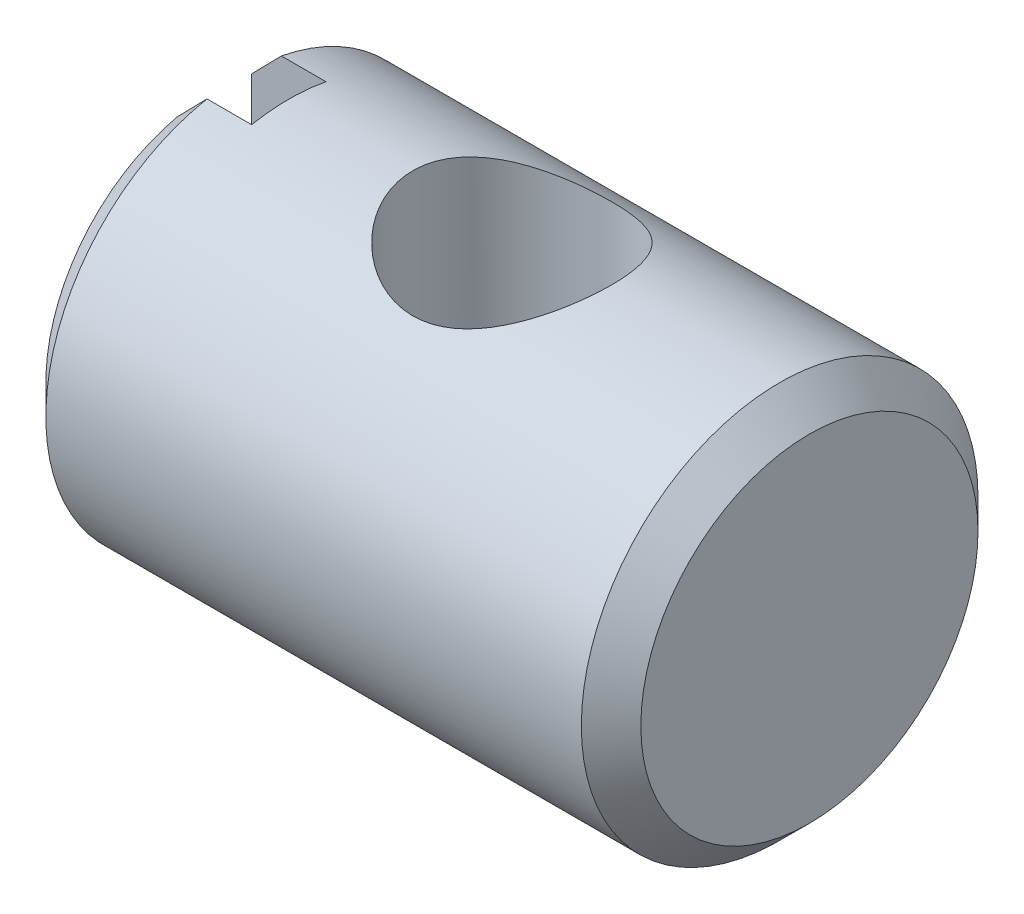
ISO-10303-21;
HEADER;
FILE_DESCRIPTION(('STEP AP214'),'2;1');
FILE_NAME('part.step','',(''),(''),'','','');
FILE_SCHEMA(('AUTOMOTIVE_DESIGN { 1 0 10303 214 1 1 1 1 }'));
ENDSEC;
DATA;
#1=APPLICATION_CONTEXT('core data for automotive mechanical design processes');
#2=APPLICATION_PROTOCOL_DEFINITION('international standard','automotive_design',2000,#1);
#3=PRODUCT_CONTEXT('',#1,'mechanical');
#4=PRODUCT('Part','Part','',(#3));
#5=PRODUCT_RELATED_PRODUCT_CATEGORY('part','',(#4));
#6=PRODUCT_DEFINITION_FORMATION('','',#4);
#7=PRODUCT_DEFINITION_CONTEXT('part definition',#1,'design');
#8=PRODUCT_DEFINITION('design','',#6,#7);
#9=PRODUCT_DEFINITION_SHAPE('','',#8);
#10=(LENGTH_UNIT() NAMED_UNIT(*) SI_UNIT(.MILLI.,.METRE.));
#11=(NAMED_UNIT(*) PLANE_ANGLE_UNIT() SI_UNIT($,.RADIAN.));
#12=(NAMED_UNIT(*) SI_UNIT($,.STERADIAN.) SOLID_ANGLE_UNIT());
#13=UNCERTAINTY_MEASURE_WITH_UNIT(LENGTH_MEASURE(1.E-05),#10,'distance_accuracy_value','');
#14=(GEOMETRIC_REPRESENTATION_CONTEXT(3) GLOBAL_UNCERTAINTY_ASSIGNED_CONTEXT((#13)) GLOBAL_UNIT_ASSIGNED_CONTEXT((#10,
#11,#12)) REPRESENTATION_CONTEXT('',''));
#15=CARTESIAN_POINT('',(0.,0.,0.));
#16=DIRECTION('',(0.,0.,1.));
#17=DIRECTION('',(1.,0.,0.));
#18=AXIS2_PLACEMENT_3D('',#15,#16,#17);
#19=CARTESIAN_POINT('',(-6.,0.,0.));
#20=DIRECTION('',(1.,0.,0.));
#21=DIRECTION('',(0.,0.,1.));
#22=AXIS2_PLACEMENT_3D('',#19,#20,#21);
#23=PLANE('',#22);
#24=CARTESIAN_POINT('',(-6.,0.,0.));
#25=DIRECTION('',(-1.,0.,0.));
#26=DIRECTION('',(0.,0.,1.));
#27=AXIS2_PLACEMENT_3D('',#24,#25,#26);
#28=CIRCLE('',#27,3.4);
#29=CARTESIAN_POINT('',(-6.,3.31624787975808,0.75));
#30=VERTEX_POINT('',#29);
#31=CARTESIAN_POINT('',(-6.,-3.31624787975808,0.75));
#32=VERTEX_POINT('',#31);
#33=EDGE_CURVE('E109',#30,#32,#28,.F.);
#34=ORIENTED_EDGE('',*,*,#33,.F.);
#35=DIRECTION('',(0.,-1.,0.));
#36=VECTOR('',#35,1.);
#37=CARTESIAN_POINT('',(-6.,-5.08936353423906,0.75));
#38=LINE('',#37,#36);
#39=EDGE_CURVE('E105',#30,#32,#38,.T.);
#40=ORIENTED_EDGE('',*,*,#39,.T.);
#41=EDGE_LOOP('',(#34,#40));
#42=FACE_BOUND('',#41,.T.);
#43=ADVANCED_FACE('F37',(#42),#23,.F.);
#44=CARTESIAN_POINT('',(-5.4,0.,0.));
#45=DIRECTION('',(1.,0.,0.));
#46=DIRECTION('',(0.,0.,1.));
#47=AXIS2_PLACEMENT_3D('',#44,#45,#46);
#48=CONICAL_SURFACE('',#47,4.,0.785398163397448);
#49=CARTESIAN_POINT('',(-0.586318931168419,8.78171247440271,0.75));
#50=CARTESIAN_POINT('',(-0.89911517881567,8.46776722729489,0.75));
#51=CARTESIAN_POINT('',(-1.21186022148148,8.1537708958006,0.75));
#52=CARTESIAN_POINT('',(-1.83719494459531,7.52558697275872,0.75));
#53=CARTESIAN_POINT('',(-2.14978461487386,7.21139937108854,0.75));
#54=CARTESIAN_POINT('',(-2.77515805316192,6.58233891694838,0.75));
#55=CARTESIAN_POINT('',(-3.08794147672292,6.26746572194293,0.75));
#56=CARTESIAN_POINT('',(-3.71310786552485,5.63735753970191,0.75));
#57=CARTESIAN_POINT('',(-4.02549085255156,5.32212257408525,0.75));
#58=CARTESIAN_POINT('',(-4.63095471200261,4.70991108309659,0.75));
#59=CARTESIAN_POINT('',(-4.92407209660478,4.41297070666081,0.75));
#60=CARTESIAN_POINT('',(-5.36301711479325,3.96679034127691,0.75));
#61=CARTESIAN_POINT('',(-5.50922280774287,3.81792242946439,0.75));
#62=CARTESIAN_POINT('',(-5.8012714742329,3.51983580450674,0.75));
#63=CARTESIAN_POINT('',(-5.94711445356469,3.37061709703764,0.75));
#64=CARTESIAN_POINT('',(-6.23815525647998,3.07179369372605,0.75));
#65=CARTESIAN_POINT('',(-6.383353516978,2.92218942405654,0.75));
#66=CARTESIAN_POINT('',(-6.6729455601872,2.62218613066518,0.75));
#67=CARTESIAN_POINT('',(-6.81733929236243,2.47178705814911,0.75));
#68=CARTESIAN_POINT('',(-7.10475426782723,2.16976130425436,0.75));
#69=CARTESIAN_POINT('',(-7.2477759093094,2.01813500412178,0.75));
#70=CARTESIAN_POINT('',(-7.46040576630658,1.78894239159525,0.75));
#71=CARTESIAN_POINT('',(-7.53096183090568,1.71225650870654,0.75));
#72=CARTESIAN_POINT('',(-7.67114403465676,1.55804045062791,0.75));
#73=CARTESIAN_POINT('',(-7.74077020981574,1.48051030834152,0.75));
#74=CARTESIAN_POINT('',(-7.82894089355626,1.38051818592761,0.75));
#75=CARTESIAN_POINT('',(-7.84814001283776,1.35863324199629,0.75));
#76=CARTESIAN_POINT('',(-7.88640996667428,1.31475109781654,0.75));
#77=CARTESIAN_POINT('',(-7.9054807998849,1.29275389639593,0.75));
#78=CARTESIAN_POINT('',(-7.96247837839367,1.22656954820506,0.75));
#79=CARTESIAN_POINT('',(-8.00018671971951,1.18219359522638,0.75));
#80=CARTESIAN_POINT('',(-8.07521139767381,1.09232954284376,0.75));
#81=CARTESIAN_POINT('',(-8.11251967226824,1.04683469214758,0.75));
#82=CARTESIAN_POINT('',(-8.18603196961103,0.954975461061185,0.75));
#83=CARTESIAN_POINT('',(-8.22223626899139,0.908611303281593,0.75));
#84=CARTESIAN_POINT('',(-8.29348308271563,0.814159220934126,0.75));
#85=CARTESIAN_POINT('',(-8.32850767361611,0.76605767964873,0.75));
#86=CARTESIAN_POINT('',(-8.39620368659304,0.668105125068649,0.75));
#87=CARTESIAN_POINT('',(-8.42887194187332,0.618251886557387,0.75));
#88=CARTESIAN_POINT('',(-8.49011198361584,0.516746551056438,0.75));
#89=CARTESIAN_POINT('',(-8.51872209860146,0.465117942665969,0.75));
#90=CARTESIAN_POINT('',(-8.56982814317297,0.358933249234864,0.75));
#91=CARTESIAN_POINT('',(-8.59234286669187,0.30438679840185,0.75));
#92=CARTESIAN_POINT('',(-8.61802261195062,0.222661735256584,0.75));
#93=CARTESIAN_POINT('',(-8.62505610986014,0.196705154324282,0.75));
#94=CARTESIAN_POINT('',(-8.63668327119189,0.144243129404284,0.75));
#95=CARTESIAN_POINT('',(-8.64127731698223,0.117737772110777,0.75));
#96=CARTESIAN_POINT('',(-8.64768999327354,0.0645252709876592,0.75));
#97=CARTESIAN_POINT('',(-8.64952279966187,0.0378198701031724,0.75));
#98=CARTESIAN_POINT('',(-8.6503131508692,-0.0156348454490843,0.75));
#99=CARTESIAN_POINT('',(-8.6492706759624,-0.0423841604168676,0.75));
#100=CARTESIAN_POINT('',(-8.64440528787136,-0.0955002479492756,0.75));
#101=CARTESIAN_POINT('',(-8.64059501621247,-0.121868205752437,0.75));
#102=CARTESIAN_POINT('',(-8.63048014930018,-0.174123602459967,0.75));
#103=CARTESIAN_POINT('',(-8.62417444936742,-0.200010823230418,0.75));
#104=CARTESIAN_POINT('',(-8.60939063400642,-0.251340911559103,0.75));
#105=CARTESIAN_POINT('',(-8.60089783294052,-0.276779482055886,0.75));
#106=CARTESIAN_POINT('',(-8.58215088842634,-0.326984908378452,0.75));
#107=CARTESIAN_POINT('',(-8.57189700515739,-0.351751862802719,0.75));
#108=CARTESIAN_POINT('',(-8.54184128834097,-0.41879721358808,0.75));
#109=CARTESIAN_POINT('',(-8.52060179926991,-0.460428199746916,0.75));
#110=CARTESIAN_POINT('',(-8.47522317647946,-0.54209238327936,0.75));
#111=CARTESIAN_POINT('',(-8.4510808862854,-0.582123777113933,0.75));
#112=CARTESIAN_POINT('',(-8.40072672716821,-0.661038955930545,0.75));
#113=CARTESIAN_POINT('',(-8.37450825006854,-0.699918487179986,0.75));
#114=CARTESIAN_POINT('',(-8.32065019422312,-0.776685038987865,0.75));
#115=CARTESIAN_POINT('',(-8.29301026661477,-0.814571812419269,0.75));
#116=CARTESIAN_POINT('',(-8.2080605632463,-0.927765545716539,0.75));
#117=CARTESIAN_POINT('',(-8.1491930190133,-1.00189997374979,0.75));
#118=CARTESIAN_POINT('',(-8.05923063658955,-1.11156691284701,0.75));
#119=CARTESIAN_POINT('',(-8.02900134378288,-1.14782675761595,0.75));
#120=CARTESIAN_POINT('',(-7.96807610532063,-1.21995170040627,0.75));
#121=CARTESIAN_POINT('',(-7.93738017859007,-1.25581681433537,0.75));
#122=CARTESIAN_POINT('',(-7.84607570269691,-1.36140263252394,0.75));
#123=CARTESIAN_POINT('',(-7.78495259254737,-1.4306773325886,0.75));
#124=CARTESIAN_POINT('',(-7.66177481425132,-1.56839537144039,0.75));
#125=CARTESIAN_POINT('',(-7.59972010396873,-1.63683867236869,0.75));
#126=CARTESIAN_POINT('',(-7.41257753872586,-1.84130512640933,0.75));
#127=CARTESIAN_POINT('',(-7.28652759563928,-1.97644628187093,0.75));
#128=CARTESIAN_POINT('',(-7.03290023140085,-2.24558248181855,0.75));
#129=CARTESIAN_POINT('',(-6.90532117214649,-2.37957597237069,0.75));
#130=CARTESIAN_POINT('',(-6.64931980167584,-2.64673393796254,0.75));
#131=CARTESIAN_POINT('',(-6.52089755906573,-2.779898478774,0.75));
#132=CARTESIAN_POINT('',(-6.26467750445008,-3.04447337872307,0.75));
#133=CARTESIAN_POINT('',(-6.1368847414103,-3.17588863552843,0.75));
#134=CARTESIAN_POINT('',(-5.88091851050585,-3.43835302392329,0.75));
#135=CARTESIAN_POINT('',(-5.75274503479878,-3.56940214786129,0.75));
#136=CARTESIAN_POINT('',(-5.36794145192988,-3.96203591841447,0.75));
#137=CARTESIAN_POINT('',(-5.1109107523662,-4.22322777332833,0.75));
#138=CARTESIAN_POINT('',(-4.50104911211646,-4.84155706238019,0.75));
#139=CARTESIAN_POINT('',(-4.1479586197436,-5.19843819113416,0.75));
#140=CARTESIAN_POINT('',(-3.44112712202132,-5.91167425229548,0.75));
#141=CARTESIAN_POINT('',(-3.08738601726198,-6.26802908612066,0.75));
#142=CARTESIAN_POINT('',(-2.37586014632471,-6.98410294385875,0.75));
#143=CARTESIAN_POINT('',(-2.01807168367367,-7.3438182936353,0.75));
#144=CARTESIAN_POINT('',(-1.30231546818728,-8.06294690781502,0.75));
#145=CARTESIAN_POINT('',(-0.944347757003069,-8.42236021366946,0.75));
#146=CARTESIAN_POINT('',(-0.586318931168417,-8.78171247440271,0.75));
#147=B_SPLINE_CURVE_WITH_KNOTS('',3,(#49,#50,#51,#52,#53,#54,#55,#56,#57,#58,#59,#60,#61,#62,
#63,#64,#65,#66,#67,#68,#69,#70,#71,#72,#73,#74,#75,#76,#77,#78,#79,#80,#81,#82,#83,#84,#85,#86,
#87,#88,#89,#90,#91,#92,#93,#94,#95,#96,#97,#98,#99,#100,#101,#102,#103,#104,#105,#106,#107,
#108,#109,#110,#111,#112,#113,#114,#115,#116,#117,#118,#119,#120,#121,#122,#123,#124,#125,#126,
#127,#128,#129,#130,#131,#132,#133,#134,#135,#136,#137,#138,#139,#140,#141,#142,#143,#144,#145,
#146),.UNSPECIFIED.,.F.,.F.,(4,2,2,2,2,2,2,2,2,2,2,2,2,2,2,2,2,2,2,2,2,2,2,2,2,2,2,2,2,2,2,2,2,
2,2,2,2,2,2,2,2,2,2,2,2,2,2,2,4),(0.,1.32952178021047,2.65912141007806,3.99058931393997,
5.32198141209922,6.57370761891138,7.19967829346922,7.82563890828647,8.4510770098977,
9.07655396485851,9.70184354845619,10.0144573204168,10.3270589521031,10.4143970118987,
10.5017359855475,10.6764297027325,10.8529263362068,11.0293783738681,11.2078396541179,
11.3865364730812,11.5634135355288,11.7397388554671,11.8203206265103,11.9008897631582,
11.9810438404542,12.0611984676466,12.1409892833747,12.2208154605846,12.3011922923892,
12.3815572596538,12.5215743525672,12.6617450994075,12.8023814540204,12.9430524908892,
13.2269383623233,13.3685623250766,13.5101805593087,13.7873224586822,14.0644769311188,
14.618860032613,15.1739023545605,15.72890006137,16.2788161077102,16.828743561587,
17.9280930269899,19.4341905537046,20.9405413578846,22.4626021474749,23.9843999937849),.UNSPECIFIED.);
#148=CARTESIAN_POINT('',(-5.4,3.92905841137543,0.75));
#149=VERTEX_POINT('',#148);
#150=EDGE_CURVE('E150',#149,#30,#147,.T.);
#151=ORIENTED_EDGE('',*,*,#150,.T.);
#152=ORIENTED_EDGE('',*,*,#33,.T.);
#153=CARTESIAN_POINT('',(-5.4,-3.92905841137543,0.75));
#154=VERTEX_POINT('',#153);
#155=EDGE_CURVE('E100',#32,#154,#147,.T.);
#156=ORIENTED_EDGE('',*,*,#155,.T.);
#157=CARTESIAN_POINT('',(-5.4,0.,0.));
#158=DIRECTION('',(-1.,0.,0.));
#159=DIRECTION('',(0.,0.,1.));
#160=AXIS2_PLACEMENT_3D('',#157,#158,#159);
#161=CIRCLE('',#160,4.);
#162=EDGE_CURVE('E116',#154,#149,#161,.T.);
#163=ORIENTED_EDGE('',*,*,#162,.T.);
#164=EDGE_LOOP('',(#151,#152,#156,#163));
#165=FACE_BOUND('',#164,.T.);
#166=ADVANCED_FACE('F137',(#165),#48,.T.);
#167=CARTESIAN_POINT('',(6.,0.,0.));
#168=DIRECTION('',(-1.,0.,0.));
#169=DIRECTION('',(0.,0.,-1.));
#170=AXIS2_PLACEMENT_3D('',#167,#168,#169);
#171=CYLINDRICAL_SURFACE('',#170,4.);
#172=ORIENTED_EDGE('',*,*,#162,.F.);
#173=DIRECTION('',(-1.,0.,0.));
#174=VECTOR('',#173,1.);
#175=CARTESIAN_POINT('',(6.,-3.92905841137543,0.75));
#176=LINE('',#175,#174);
#177=CARTESIAN_POINT('',(-4.5,-3.92905841137543,0.75));
#178=VERTEX_POINT('',#177);
#179=EDGE_CURVE('E187',#178,#154,#176,.T.);
#180=ORIENTED_EDGE('',*,*,#179,.F.);
#181=CARTESIAN_POINT('',(-4.5,0.,0.));
#182=DIRECTION('',(1.,0.,0.));
#183=DIRECTION('',(0.,0.,-1.));
#184=AXIS2_PLACEMENT_3D('',#181,#182,#183);
#185=CIRCLE('',#184,4.);
#186=CARTESIAN_POINT('',(-4.5,-3.92905841137543,-0.75));
#187=VERTEX_POINT('',#186);
#188=EDGE_CURVE('E41',#178,#187,#185,.T.);
#189=ORIENTED_EDGE('',*,*,#188,.T.);
#190=DIRECTION('',(-1.,0.,0.));
#191=VECTOR('',#190,1.);
#192=CARTESIAN_POINT('',(6.,-3.92905841137543,-0.75));
#193=LINE('',#192,#191);
#194=CARTESIAN_POINT('',(-5.4,-3.92905841137543,-0.75));
#195=VERTEX_POINT('',#194);
#196=EDGE_CURVE('E191',#195,#187,#193,.F.);
#197=ORIENTED_EDGE('',*,*,#196,.F.);
#198=CARTESIAN_POINT('',(-5.4,3.92905841137543,-0.75));
#199=VERTEX_POINT('',#198);
#200=EDGE_CURVE('E97',#199,#195,#161,.T.);
#201=ORIENTED_EDGE('',*,*,#200,.F.);
#202=DIRECTION('',(-1.,0.,0.));
#203=VECTOR('',#202,1.);
#204=CARTESIAN_POINT('',(6.,3.92905841137543,-0.75));
#205=LINE('',#204,#203);
#206=CARTESIAN_POINT('',(-4.5,3.92905841137543,-0.75));
#207=VERTEX_POINT('',#206);
#208=EDGE_CURVE('E193',#207,#199,#205,.T.);
#209=ORIENTED_EDGE('',*,*,#208,.F.);
#210=CARTESIAN_POINT('',(-4.5,3.92905841137543,0.75));
#211=VERTEX_POINT('',#210);
#212=EDGE_CURVE('E11',#207,#211,#185,.T.);
#213=ORIENTED_EDGE('',*,*,#212,.T.);
#214=DIRECTION('',(-1.,0.,0.));
#215=VECTOR('',#214,1.);
#216=CARTESIAN_POINT('',(6.,3.92905841137543,0.75));
#217=LINE('',#216,#215);
#218=EDGE_CURVE('E59',#149,#211,#217,.F.);
#219=ORIENTED_EDGE('',*,*,#218,.F.);
#220=EDGE_LOOP('',(#172,#180,#189,#197,#201,#209,#213,#219));
#221=FACE_BOUND('',#220,.T.);
#222=CARTESIAN_POINT('',(-2.,-4.,0.));
#223=CARTESIAN_POINT('',(-1.99999339536562,-3.99999426810082,-0.105143925902467));
#224=CARTESIAN_POINT('',(-1.99165985375789,-3.99580982039513,-0.210413199395125));
#225=CARTESIAN_POINT('',(-1.95869423931692,-3.97948312074314,-0.417840470537792));
#226=CARTESIAN_POINT('',(-1.93403121400437,-3.96732575657839,-0.519992173427259));
#227=CARTESIAN_POINT('',(-1.86961238276674,-3.93632558806751,-0.717867089760897));
#228=CARTESIAN_POINT('',(-1.82991523150406,-3.91750878355075,-0.813613605878292));
#229=CARTESIAN_POINT('',(-1.73685875727003,-3.87491553031523,-0.996945233613197));
#230=CARTESIAN_POINT('',(-1.68350051150227,-3.8511394726705,-1.08453098798012));
#231=CARTESIAN_POINT('',(-1.56096550102943,-3.79912516516124,-1.25501563552382));
#232=CARTESIAN_POINT('',(-1.49102704152072,-3.77070398255074,-1.33731042224422));
#233=CARTESIAN_POINT('',(-1.33895704150593,-3.71319940493486,-1.48955888973396));
#234=CARTESIAN_POINT('',(-1.25681629645512,-3.68411552418069,-1.55950316621353));
#235=CARTESIAN_POINT('',(-1.07503330095324,-3.62597902394695,-1.69050400090056));
#236=CARTESIAN_POINT('',(-0.974527803308175,-3.59710373940264,-1.75045067110327));
#237=CARTESIAN_POINT('',(-0.763265328027571,-3.54571957544641,-1.85233645378139));
#238=CARTESIAN_POINT('',(-0.652515742554502,-3.52320615213979,-1.89428842993267));
#239=CARTESIAN_POINT('',(-0.430669789156156,-3.48915734075617,-1.95626488437718));
#240=CARTESIAN_POINT('',(-0.319991095865212,-3.47704543167427,-1.97745171416088));
#241=CARTESIAN_POINT('',(-0.0960423244410468,-3.46363779897055,-2.00085398661769));
#242=CARTESIAN_POINT('',(0.017225081742309,-3.46233138686576,-2.00308817674615));
#243=CARTESIAN_POINT('',(0.228572048630736,-3.47021860514497,-1.98937457434459));
#244=CARTESIAN_POINT('',(0.3268480624461,-3.47817527324027,-1.97556911907364));
#245=CARTESIAN_POINT('',(0.519443818746084,-3.50152457467701,-1.93387969811386));
#246=CARTESIAN_POINT('',(0.613762290610631,-3.51691957663553,-1.9059912477953));
#247=CARTESIAN_POINT('',(0.798458265131318,-3.55374952825482,-1.83641956077201));
#248=CARTESIAN_POINT('',(0.888692797571577,-3.57531681327997,-1.79443013423199));
#249=CARTESIAN_POINT('',(1.06126858518002,-3.62206808562807,-1.698083375336));
#250=CARTESIAN_POINT('',(1.14360627120018,-3.64725369560381,-1.64372048762494));
#251=CARTESIAN_POINT('',(1.30904250548645,-3.70226315806572,-1.51613210982558));
#252=CARTESIAN_POINT('',(1.39091374715231,-3.73227020473492,-1.44138891673856));
#253=CARTESIAN_POINT('',(1.5414708371818,-3.79095246600814,-1.27911115748275));
#254=CARTESIAN_POINT('',(1.61015038406777,-3.81962703917602,-1.19157051314857));
#255=CARTESIAN_POINT('',(1.73537132205945,-3.87403974565928,-1.0010330116637));
#256=CARTESIAN_POINT('',(1.79120094489148,-3.89957968324014,-0.897507183198818));
#257=CARTESIAN_POINT('',(1.88419405808602,-3.94315762242485,-0.680932430977594));
#258=CARTESIAN_POINT('',(1.92137237003033,-3.96120157887106,-0.567891152530552));
#259=CARTESIAN_POINT('',(1.97295080743335,-3.98648667482871,-0.345532983321405));
#260=CARTESIAN_POINT('',(1.98898247149356,-3.9944987660262,-0.236683061096653));
#261=CARTESIAN_POINT('',(2.00292946226897,-4.00146026918207,-0.0175591998987039));
#262=CARTESIAN_POINT('',(2.00085337127894,-4.00041397442637,0.0927140397398167));
#263=CARTESIAN_POINT('',(1.97958662316251,-3.9898238450687,0.302465943971973));
#264=CARTESIAN_POINT('',(1.96173493454001,-3.98094491376337,0.402118816099859));
#265=CARTESIAN_POINT('',(1.91152385620976,-3.95644342629681,0.596813784603881));
#266=CARTESIAN_POINT('',(1.87916286709301,-3.94082012668824,0.691855371382173));
#267=CARTESIAN_POINT('',(1.80000306713393,-3.90368502827176,0.877777216899145));
#268=CARTESIAN_POINT('',(1.75281789976743,-3.88201763539262,0.968460794011606));
#269=CARTESIAN_POINT('',(1.64578492870687,-3.83487948634835,1.14092272339854));
#270=CARTESIAN_POINT('',(1.58593173080921,-3.80940711133877,1.22269725955318));
#271=CARTESIAN_POINT('',(1.44847914933857,-3.75416442672396,1.38353537857843));
#272=CARTESIAN_POINT('',(1.36971426310971,-3.72421769686998,1.46154415563805));
#273=CARTESIAN_POINT('',(1.20014969744455,-3.6652478321764,1.60371264223771));
#274=CARTESIAN_POINT('',(1.10934176230416,-3.63622534800094,1.66786277142375));
#275=CARTESIAN_POINT('',(0.912712691654049,-3.58102384412979,1.78341582895803));
#276=CARTESIAN_POINT('',(0.806377467811038,-3.55505059178121,1.8340509916005));
#277=CARTESIAN_POINT('',(0.584979864850069,-3.51148144588269,1.91616565186941));
#278=CARTESIAN_POINT('',(0.469928947066221,-3.493874764435,1.94766983173403));
#279=CARTESIAN_POINT('',(0.246179554230593,-3.47123002051604,1.98772337493374));
#280=CARTESIAN_POINT('',(0.137931493129518,-3.4651476693013,1.9981859928109));
#281=CARTESIAN_POINT('',(-0.0788941343290485,-3.46330709283206,2.0013783087524));
#282=CARTESIAN_POINT('',(-0.187471537475722,-3.4675443925278,1.99411569324648));
#283=CARTESIAN_POINT('',(-0.390967003066873,-3.48475724102153,1.96385225118662));
#284=CARTESIAN_POINT('',(-0.486200940289478,-3.49686188965317,1.94241662868607));
#285=CARTESIAN_POINT('',(-0.671616238848732,-3.52742032375305,1.88635071644882));
#286=CARTESIAN_POINT('',(-0.761795964184062,-3.54587615139337,1.85171618231984));
#287=CARTESIAN_POINT('',(-0.941249701973073,-3.58857060729071,1.76763149060113));
#288=CARTESIAN_POINT('',(-1.03005580365806,-3.61311444791841,1.7173422756314));
#289=CARTESIAN_POINT('',(-1.19854907236252,-3.66470663269721,1.60430194327479));
#290=CARTESIAN_POINT('',(-1.27823146104222,-3.69175627591221,1.54154434248312));
#291=CARTESIAN_POINT('',(-1.43628396470935,-3.74924646316184,1.39640665332275));
#292=CARTESIAN_POINT('',(-1.51331820470058,-3.77969966613256,1.31256884599452));
#293=CARTESIAN_POINT('',(-1.65252596687054,-3.83755504519861,1.1323096124664));
#294=CARTESIAN_POINT('',(-1.71469147893981,-3.8649555725239,1.0358814466104));
#295=CARTESIAN_POINT('',(-1.82247272542414,-3.91396019133075,0.831863193565893));
#296=CARTESIAN_POINT('',(-1.86796833847293,-3.93552192987866,0.724199007553463));
#297=CARTESIAN_POINT('',(-1.93961633551482,-3.97002682597974,0.501484202276175));
#298=CARTESIAN_POINT('',(-1.96582369361143,-3.98299446726136,0.386455599178202));
#299=CARTESIAN_POINT('',(-1.98779482217148,-3.99390923826956,0.225203892981792));
#300=CARTESIAN_POINT('',(-1.99236528173268,-3.99618730680502,0.180323758883131));
#301=CARTESIAN_POINT('',(-1.99846933102817,-3.99923393953631,0.0903034636101842));
#302=CARTESIAN_POINT('',(-2.00000283694042,-4.00000246206762,0.0451632952932574));
#303=CARTESIAN_POINT('',(-2.,-4.,0.));
#304=B_SPLINE_CURVE_WITH_KNOTS('',3,(#222,#223,#224,#225,#226,#227,#228,#229,#230,#231,#232,
#233,#234,#235,#236,#237,#238,#239,#240,#241,#242,#243,#244,#245,#246,#247,#248,#249,#250,#251,
#252,#253,#254,#255,#256,#257,#258,#259,#260,#261,#262,#263,#264,#265,#266,#267,#268,#269,#270,
#271,#272,#273,#274,#275,#276,#277,#278,#279,#280,#281,#282,#283,#284,#285,#286,#287,#288,#289,
#290,#291,#292,#293,#294,#295,#296,#297,#298,#299,#300,#301,#302,#303),.UNSPECIFIED.,.T.,.F.,(4,
2,2,2,2,2,2,2,2,2,2,2,2,2,2,2,2,2,2,2,2,2,2,2,2,2,2,2,2,2,2,2,2,2,2,2,2,2,2,2,4),(0.,
0.315248514840585,0.631096299418395,0.945724310984596,1.26032752116313,1.59396351743618,
1.92785247530807,2.28763452861505,2.64715895796562,2.98516024280459,3.32282714658041,
3.62011424818641,3.91749607851357,4.22180480336975,4.52625042520444,4.86929882667757,
5.21251069197373,5.57166044428881,5.93052433824559,6.25966580942691,6.58865129022952,
6.89213813012244,7.19565843261863,7.50785712055797,7.82018901496678,8.16319221288838,
8.50643177230863,8.86629364323451,9.22569023890901,9.55058615006093,9.87534119729357,
10.1691586049771,10.463070575767,10.7767291356057,11.0905512228726,11.4425048551434,
11.7946476676249,12.1492802732705,12.502898172423,12.6383056026783,12.7737167702213),.UNSPECIFIED.);
#305=CARTESIAN_POINT('',(-2.,-4.,0.));
#306=VERTEX_POINT('',#305);
#307=EDGE_CURVE('E125',#306,#306,#304,.T.);
#308=ORIENTED_EDGE('',*,*,#307,.F.);
#309=EDGE_LOOP('',(#308));
#310=FACE_BOUND('',#309,.T.);
#311=CARTESIAN_POINT('',(0.,3.46410161513775,-2.));
#312=CARTESIAN_POINT('',(-0.104213205474344,3.46411185715888,-1.99999158748781));
#313=CARTESIAN_POINT('',(-0.208562176533799,3.46887633544978,-1.99179963610437));
#314=CARTESIAN_POINT('',(-0.414055177230601,3.48724701669072,-1.95944672580053));
#315=CARTESIAN_POINT('',(-0.515192003247761,3.50087179788183,-1.93525221095662));
#316=CARTESIAN_POINT('',(-0.710903156446934,3.53498701490002,-1.8721998159803));
#317=CARTESIAN_POINT('',(-0.805509258849251,3.55544089069169,-1.83341988295963));
#318=CARTESIAN_POINT('',(-0.986848450476154,3.60085327291133,-1.74253507245138));
#319=CARTESIAN_POINT('',(-1.07358111343677,3.62581202301253,-1.69042947410139));
#320=CARTESIAN_POINT('',(-1.24461144313338,3.67993738819289,-1.569333074538));
#321=CARTESIAN_POINT('',(-1.32811826759177,3.70928127465103,-1.49930407053533));
#322=CARTESIAN_POINT('',(-1.4828167805706,3.76743965382121,-1.34650761698202));
#323=CARTESIAN_POINT('',(-1.55400232620397,3.79625387610258,-1.26373385204841));
#324=CARTESIAN_POINT('',(-1.6867343011885,3.85242953961661,-1.08097912631265));
#325=CARTESIAN_POINT('',(-1.74730753542331,3.87956212851245,-0.980214377887153));
#326=CARTESIAN_POINT('',(-1.85028170678709,3.92701512184167,-0.768314053336917));
#327=CARTESIAN_POINT('',(-1.8926941123508,3.94733982363631,-0.657185076311985));
#328=CARTESIAN_POINT('',(-1.95500932253118,3.97760922492053,-0.436089887818817));
#329=CARTESIAN_POINT('',(-1.9762990526921,3.9881896044274,-0.326603580968785));
#330=CARTESIAN_POINT('',(-2.00033223736903,4.00015167691179,-0.10514125740454));
#331=CARTESIAN_POINT('',(-2.00308691359628,4.00153893568935,0.00683321168520786));
#332=CARTESIAN_POINT('',(-1.99050665205486,3.99525963833124,0.219665048849573));
#333=CARTESIAN_POINT('',(-1.97672396895636,3.98836991784381,0.320642398354139));
#334=CARTESIAN_POINT('',(-1.93423831219188,3.96748490519435,0.518627543836089));
#335=CARTESIAN_POINT('',(-1.90553422204788,3.95348908132771,0.615635042187702));
#336=CARTESIAN_POINT('',(-1.83383486782005,3.91943166575325,0.80461878313926));
#337=CARTESIAN_POINT('',(-1.79064737365578,3.89928883058403,0.896506847030398));
#338=CARTESIAN_POINT('',(-1.6914731675971,3.8547529197337,1.07195360302662));
#339=CARTESIAN_POINT('',(-1.63548187339532,3.83035832314967,1.15550929767728));
#340=CARTESIAN_POINT('',(-1.50620929693394,3.7768878879846,1.3203473217964));
#341=CARTESIAN_POINT('',(-1.43179394334797,3.7475875199635,1.40066815005873));
#342=CARTESIAN_POINT('',(-1.27082055013965,3.68908681173623,1.54820874059556));
#343=CARTESIAN_POINT('',(-1.18425325545188,3.65988656531257,1.61541842314846));
#344=CARTESIAN_POINT('',(-0.994703615151822,3.60288312184969,1.73901066928442));
#345=CARTESIAN_POINT('',(-0.891027953891577,3.57528639981415,1.7944346299561));
#346=CARTESIAN_POINT('',(-0.674124657282003,3.52750900557152,1.88663822600246));
#347=CARTESIAN_POINT('',(-0.560907133964873,3.50732060092135,1.92343731642178));
#348=CARTESIAN_POINT('',(-0.337570977434419,3.47889271634069,1.97436042205008));
#349=CARTESIAN_POINT('',(-0.227917761912901,3.46983311696993,1.99005024423995));
#350=CARTESIAN_POINT('',(-0.00719731696690888,3.46235838723219,2.00303389322285));
#351=CARTESIAN_POINT('',(0.103868858239598,3.46393573778623,2.00034071463005));
#352=CARTESIAN_POINT('',(0.311307837157438,3.4766867308117,1.97807208668793));
#353=CARTESIAN_POINT('',(0.407958902215785,3.48679175013308,1.96037563342492));
#354=CARTESIAN_POINT('',(0.596735572541989,3.51388043102682,1.91139256926489));
#355=CARTESIAN_POINT('',(0.688859701493482,3.53086632010068,1.88010155724727));
#356=CARTESIAN_POINT('',(0.870822661805116,3.57072444159313,1.80329517720973));
#357=CARTESIAN_POINT('',(0.960358033706051,3.59383286486126,1.7571881273853));
#358=CARTESIAN_POINT('',(1.13093854307904,3.643122389945,1.65257412803176));
#359=CARTESIAN_POINT('',(1.21197928703051,3.66930506710298,1.59406080866498));
#360=CARTESIAN_POINT('',(1.37395753504266,3.72575996912669,1.45767433439708));
#361=CARTESIAN_POINT('',(1.45359430141778,3.75613166308566,1.37829054462748));
#362=CARTESIAN_POINT('',(1.59882447600473,3.81468469955797,1.20680899079904));
#363=CARTESIAN_POINT('',(1.66441314052684,3.84286530015463,1.11470694931991));
#364=CARTESIAN_POINT('',(1.78114745183271,3.89482723381868,0.917070725108058));
#365=CARTESIAN_POINT('',(1.83186623616677,3.91847283343884,0.811246195112494));
#366=CARTESIAN_POINT('',(1.91427580796961,3.95766709918776,0.591044729317865));
#367=CARTESIAN_POINT('',(1.9459833036841,3.97322287353397,0.476675402917652));
#368=CARTESIAN_POINT('',(1.98673712748514,3.99335016363174,0.253959364539763));
#369=CARTESIAN_POINT('',(1.99759574866428,3.9987985581427,0.146022887268299));
#370=CARTESIAN_POINT('',(2.00168653399567,4.00084260752374,-0.0702519714699466));
#371=CARTESIAN_POINT('',(1.99492486852887,3.99744136141634,-0.178590198981615));
#372=CARTESIAN_POINT('',(1.9651671756836,3.98267937668509,-0.38507598613686));
#373=CARTESIAN_POINT('',(1.94327026269095,3.97185789309443,-0.483424641057419));
#374=CARTESIAN_POINT('',(1.88534604019333,3.94384187353387,-0.674891898931565));
#375=CARTESIAN_POINT('',(1.84931670429309,3.92664642364424,-0.768009749669773));
#376=CARTESIAN_POINT('',(1.7625457450086,3.8865186139318,-0.950846833596741));
#377=CARTESIAN_POINT('',(1.71124078024814,3.86337234005404,-1.0402503657229));
#378=CARTESIAN_POINT('',(1.59608471188191,3.81376266676027,-1.20954920326828));
#379=CARTESIAN_POINT('',(1.53222784589843,3.78729774583427,-1.28944011444319));
#380=CARTESIAN_POINT('',(1.38640336444059,3.73057218840582,-1.44582833859495));
#381=CARTESIAN_POINT('',(1.30326581919971,3.70019591726075,-1.52119665879199));
#382=CARTESIAN_POINT('',(1.12510777169391,3.64126158628571,-1.65732528394006));
#383=CARTESIAN_POINT('',(1.03007686863948,3.61270515130784,-1.71807266521244));
#384=CARTESIAN_POINT('',(0.826691105869755,3.55999186256751,-1.82486714716811));
#385=CARTESIAN_POINT('',(0.718010089264727,3.53600256268535,-1.87038902381914));
#386=CARTESIAN_POINT('',(0.549421880369055,3.5069621813237,-1.92395929504801));
#387=CARTESIAN_POINT('',(0.492352179409321,3.49844389329401,-1.93935666147967));
#388=CARTESIAN_POINT('',(0.376767442499811,3.48406059323535,-1.96508069805043));
#389=CARTESIAN_POINT('',(0.318253447245748,3.47819372636051,-1.97541091343282));
#390=CARTESIAN_POINT('',(0.21639921075271,3.47059023668758,-1.9887293296122));
#391=CARTESIAN_POINT('',(0.173266942749926,3.46816389731816,-1.99295091983786));
#392=CARTESIAN_POINT('',(0.0867643069071045,3.46491740045177,-1.99858810035606));
#393=CARTESIAN_POINT('',(0.0433939233333004,3.46409735040492,-2.00000350293331));
#394=CARTESIAN_POINT('',(0.,3.46410161513775,-2.));
#395=B_SPLINE_CURVE_WITH_KNOTS('',3,(#311,#312,#313,#314,#315,#316,#317,#318,#319,#320,#321,
#322,#323,#324,#325,#326,#327,#328,#329,#330,#331,#332,#333,#334,#335,#336,#337,#338,#339,#340,
#341,#342,#343,#344,#345,#346,#347,#348,#349,#350,#351,#352,#353,#354,#355,#356,#357,#358,#359,
#360,#361,#362,#363,#364,#365,#366,#367,#368,#369,#370,#371,#372,#373,#374,#375,#376,#377,#378,
#379,#380,#381,#382,#383,#384,#385,#386,#387,#388,#389,#390,#391,#392,#393,#394),.UNSPECIFIED.,
.T.,.F.,(4,2,2,2,2,2,2,2,2,2,2,2,2,2,2,2,2,2,2,2,2,2,2,2,2,2,2,2,2,2,2,2,2,2,2,2,2,2,2,2,2,4),
(0.,0.312464245189431,0.62558578564961,0.937057191861536,1.24854545093097,1.58572462503713,
1.92307142172809,2.28315784481594,2.64301653931849,2.97726969939937,3.31132047376147,
3.61632194973143,3.92134625038977,4.2305906946636,4.5399459870461,4.87854382917848,
5.21740096495904,5.57777683462963,5.93777548427476,6.2692458171249,6.60048186380813,
6.89548366852118,7.19058104876193,7.49934592816242,7.80826972444161,8.15613487165293,
8.50411729960471,8.86128362829998,9.2181355962161,9.5422454078304,9.8662417359201,
10.1688884974705,10.4715786702809,10.7872150144301,11.1029966020551,11.450204837042,
11.7977188569438,12.1562149808128,12.3351395323571,12.5139387197526,12.6440387634036,
12.7741475095882),.UNSPECIFIED.);
#396=CARTESIAN_POINT('',(0.,3.46410161513775,-2.));
#397=VERTEX_POINT('',#396);
#398=EDGE_CURVE('E112',#397,#397,#395,.T.);
#399=ORIENTED_EDGE('',*,*,#398,.F.);
#400=EDGE_LOOP('',(#399));
#401=FACE_BOUND('',#400,.T.);
#402=CARTESIAN_POINT('',(5.4,0.,0.));
#403=DIRECTION('',(-1.,0.,0.));
#404=DIRECTION('',(0.,0.,1.));
#405=AXIS2_PLACEMENT_3D('',#402,#403,#404);
#406=CIRCLE('',#405,4.);
#407=CARTESIAN_POINT('',(5.4,0.,-4.));
#408=VERTEX_POINT('',#407);
#409=EDGE_CURVE('E185',#408,#408,#406,.F.);
#410=ORIENTED_EDGE('',*,*,#409,.F.);
#411=EDGE_LOOP('',(#410));
#412=FACE_BOUND('',#411,.T.);
#413=ADVANCED_FACE('F132',(#221,#310,#401,#412),#171,.T.);
#414=CARTESIAN_POINT('',(6.,0.,0.));
#415=DIRECTION('',(1.,0.,0.));
#416=DIRECTION('',(0.,0.,1.));
#417=AXIS2_PLACEMENT_3D('',#414,#415,#416);
#418=PLANE('',#417);
#419=CARTESIAN_POINT('',(6.,0.,0.));
#420=DIRECTION('',(-1.,0.,0.));
#421=DIRECTION('',(0.,0.,1.));
#422=AXIS2_PLACEMENT_3D('',#419,#420,#421);
#423=CIRCLE('',#422,3.4);
#424=CARTESIAN_POINT('',(6.,0.,-3.4));
#425=VERTEX_POINT('',#424);
#426=EDGE_CURVE('E108',#425,#425,#423,.T.);
#427=ORIENTED_EDGE('',*,*,#426,.F.);
#428=EDGE_LOOP('',(#427));
#429=FACE_BOUND('',#428,.T.);
#430=ADVANCED_FACE('F136',(#429),#418,.T.);
#431=CARTESIAN_POINT('',(-6.,-3.31624787975808,-0.75));
#432=VERTEX_POINT('',#431);
#433=CARTESIAN_POINT('',(-6.,3.31624787975808,-0.75));
#434=VERTEX_POINT('',#433);
#435=EDGE_CURVE('E95',#432,#434,#28,.F.);
#436=ORIENTED_EDGE('',*,*,#435,.F.);
#437=DIRECTION('',(0.,1.,0.));
#438=VECTOR('',#437,1.);
#439=CARTESIAN_POINT('',(-6.,-5.08936353423906,-0.75));
#440=LINE('',#439,#438);
#441=EDGE_CURVE('E102',#432,#434,#440,.T.);
#442=ORIENTED_EDGE('',*,*,#441,.T.);
#443=EDGE_LOOP('',(#436,#442));
#444=FACE_BOUND('',#443,.T.);
#445=ADVANCED_FACE('F107',(#444),#23,.F.);
#446=CARTESIAN_POINT('',(-0.586318931168417,-8.78171247440271,-0.75));
#447=CARTESIAN_POINT('',(-0.899115178815668,-8.46776722729489,-0.75));
#448=CARTESIAN_POINT('',(-1.21186022148148,-8.1537708958006,-0.75));
#449=CARTESIAN_POINT('',(-1.83719494459531,-7.52558697275872,-0.75));
#450=CARTESIAN_POINT('',(-2.14978461487386,-7.21139937108854,-0.75));
#451=CARTESIAN_POINT('',(-2.77515805316192,-6.58233891694838,-0.75));
#452=CARTESIAN_POINT('',(-3.08794147672292,-6.26746572194293,-0.75));
#453=CARTESIAN_POINT('',(-3.71310786552485,-5.63735753970191,-0.75));
#454=CARTESIAN_POINT('',(-4.02549085255156,-5.32212257408525,-0.75));
#455=CARTESIAN_POINT('',(-4.63095471200261,-4.70991108309659,-0.75));
#456=CARTESIAN_POINT('',(-4.92407209660478,-4.41297070666081,-0.75));
#457=CARTESIAN_POINT('',(-5.36301711479325,-3.96679034127691,-0.75));
#458=CARTESIAN_POINT('',(-5.50922280774287,-3.81792242946439,-0.75));
#459=CARTESIAN_POINT('',(-5.8012714742329,-3.51983580450674,-0.75));
#460=CARTESIAN_POINT('',(-5.94711445356469,-3.37061709703764,-0.75));
#461=CARTESIAN_POINT('',(-6.23815525647998,-3.07179369372605,-0.75));
#462=CARTESIAN_POINT('',(-6.383353516978,-2.92218942405654,-0.75));
#463=CARTESIAN_POINT('',(-6.6729455601872,-2.62218613066518,-0.75));
#464=CARTESIAN_POINT('',(-6.81733929236243,-2.47178705814911,-0.75));
#465=CARTESIAN_POINT('',(-7.10475426782723,-2.16976130425436,-0.75));
#466=CARTESIAN_POINT('',(-7.2477759093094,-2.01813500412178,-0.75));
#467=CARTESIAN_POINT('',(-7.46040576630658,-1.78894239159525,-0.75));
#468=CARTESIAN_POINT('',(-7.53096183090567,-1.71225650870654,-0.75));
#469=CARTESIAN_POINT('',(-7.67114403465676,-1.55804045062791,-0.75));
#470=CARTESIAN_POINT('',(-7.74077020981575,-1.48051030834152,-0.75));
#471=CARTESIAN_POINT('',(-7.82894089355627,-1.38051818592761,-0.75));
#472=CARTESIAN_POINT('',(-7.84814001283776,-1.35863324199629,-0.75));
#473=CARTESIAN_POINT('',(-7.88640996667428,-1.31475109781654,-0.75));
#474=CARTESIAN_POINT('',(-7.9054807998849,-1.29275389639592,-0.75));
#475=CARTESIAN_POINT('',(-7.96247837839367,-1.22656954820506,-0.75));
#476=CARTESIAN_POINT('',(-8.00018671971951,-1.18219359522638,-0.75));
#477=CARTESIAN_POINT('',(-8.07521139767381,-1.09232954284376,-0.75));
#478=CARTESIAN_POINT('',(-8.11251967226824,-1.04683469214758,-0.75));
#479=CARTESIAN_POINT('',(-8.18603196961103,-0.954975461061185,-0.75));
#480=CARTESIAN_POINT('',(-8.22223626899139,-0.908611303281593,-0.75));
#481=CARTESIAN_POINT('',(-8.29348308271563,-0.814159220934126,-0.75));
#482=CARTESIAN_POINT('',(-8.32850767361611,-0.76605767964873,-0.75));
#483=CARTESIAN_POINT('',(-8.39620368659304,-0.668105125068649,-0.75));
#484=CARTESIAN_POINT('',(-8.42887194187332,-0.618251886557387,-0.75));
#485=CARTESIAN_POINT('',(-8.49011198361584,-0.516746551056438,-0.75));
#486=CARTESIAN_POINT('',(-8.51872209860146,-0.465117942665969,-0.75));
#487=CARTESIAN_POINT('',(-8.56982814317297,-0.358933249234864,-0.75));
#488=CARTESIAN_POINT('',(-8.59234286669187,-0.30438679840185,-0.75));
#489=CARTESIAN_POINT('',(-8.61802261195062,-0.222661735256586,-0.75));
#490=CARTESIAN_POINT('',(-8.62505610986014,-0.196705154324284,-0.75));
#491=CARTESIAN_POINT('',(-8.63668327119189,-0.144243129404286,-0.75));
#492=CARTESIAN_POINT('',(-8.64127731698223,-0.117737772110779,-0.75));
#493=CARTESIAN_POINT('',(-8.64768999327354,-0.0645252709876596,-0.75));
#494=CARTESIAN_POINT('',(-8.64952279966187,-0.0378198701031728,-0.75));
#495=CARTESIAN_POINT('',(-8.6503131508692,0.015634845449084,-0.75));
#496=CARTESIAN_POINT('',(-8.6492706759624,0.0423841604168673,-0.75));
#497=CARTESIAN_POINT('',(-8.64440528787136,0.0955002479492754,-0.75));
#498=CARTESIAN_POINT('',(-8.64059501621247,0.121868205752437,-0.75));
#499=CARTESIAN_POINT('',(-8.63048014930018,0.174123602459967,-0.75));
#500=CARTESIAN_POINT('',(-8.62417444936742,0.200010823230418,-0.75));
#501=CARTESIAN_POINT('',(-8.60939063400642,0.251340911559102,-0.75));
#502=CARTESIAN_POINT('',(-8.60089783294052,0.276779482055886,-0.75));
#503=CARTESIAN_POINT('',(-8.58215088842634,0.326984908378452,-0.75));
#504=CARTESIAN_POINT('',(-8.57189700515739,0.351751862802719,-0.75));
#505=CARTESIAN_POINT('',(-8.54184128834097,0.41879721358808,-0.75));
#506=CARTESIAN_POINT('',(-8.52060179926991,0.460428199746915,-0.75));
#507=CARTESIAN_POINT('',(-8.47522317647946,0.542092383279359,-0.75));
#508=CARTESIAN_POINT('',(-8.4510808862854,0.582123777113931,-0.75));
#509=CARTESIAN_POINT('',(-8.40072672716821,0.661038955930544,-0.75));
#510=CARTESIAN_POINT('',(-8.37450825006854,0.699918487179985,-0.75));
#511=CARTESIAN_POINT('',(-8.32065019422312,0.776685038987865,-0.75));
#512=CARTESIAN_POINT('',(-8.29301026661477,0.814571812419269,-0.75));
#513=CARTESIAN_POINT('',(-8.2080605632463,0.92776554571654,-0.75));
#514=CARTESIAN_POINT('',(-8.1491930190133,1.00189997374979,-0.75));
#515=CARTESIAN_POINT('',(-8.05923063658955,1.11156691284701,-0.75));
#516=CARTESIAN_POINT('',(-8.02900134378288,1.14782675761595,-0.75));
#517=CARTESIAN_POINT('',(-7.96807610532063,1.21995170040627,-0.75));
#518=CARTESIAN_POINT('',(-7.93738017859007,1.25581681433537,-0.75));
#519=CARTESIAN_POINT('',(-7.8460757026969,1.36140263252394,-0.75));
#520=CARTESIAN_POINT('',(-7.78495259254737,1.4306773325886,-0.75));
#521=CARTESIAN_POINT('',(-7.66177481425132,1.56839537144039,-0.75));
#522=CARTESIAN_POINT('',(-7.59972010396873,1.63683867236869,-0.75));
#523=CARTESIAN_POINT('',(-7.41257753872586,1.84130512640934,-0.75));
#524=CARTESIAN_POINT('',(-7.28652759563928,1.97644628187094,-0.75));
#525=CARTESIAN_POINT('',(-7.03290023140085,2.24558248181855,-0.75));
#526=CARTESIAN_POINT('',(-6.90532117214649,2.37957597237069,-0.75));
#527=CARTESIAN_POINT('',(-6.64931980167584,2.64673393796254,-0.75));
#528=CARTESIAN_POINT('',(-6.52089755906573,2.779898478774,-0.75));
#529=CARTESIAN_POINT('',(-6.26467750445008,3.04447337872307,-0.75));
#530=CARTESIAN_POINT('',(-6.1368847414103,3.17588863552843,-0.75));
#531=CARTESIAN_POINT('',(-5.88091851050585,3.4383530239233,-0.75));
#532=CARTESIAN_POINT('',(-5.75274503479877,3.5694021478613,-0.75));
#533=CARTESIAN_POINT('',(-5.36794145192988,3.96203591841447,-0.75));
#534=CARTESIAN_POINT('',(-5.11091075236619,4.22322777332834,-0.75));
#535=CARTESIAN_POINT('',(-4.50104911211645,4.84155706238019,-0.75));
#536=CARTESIAN_POINT('',(-4.14795861974359,5.19843819113416,-0.75));
#537=CARTESIAN_POINT('',(-3.44112712202132,5.91167425229549,-0.75));
#538=CARTESIAN_POINT('',(-3.08738601726198,6.26802908612066,-0.75));
#539=CARTESIAN_POINT('',(-2.37586014632471,6.98410294385875,-0.75));
#540=CARTESIAN_POINT('',(-2.01807168367367,7.3438182936353,-0.75));
#541=CARTESIAN_POINT('',(-1.30231546818728,8.06294690781502,-0.75));
#542=CARTESIAN_POINT('',(-0.94434775700307,8.42236021366945,-0.75));
#543=CARTESIAN_POINT('',(-0.586318931168416,8.78171247440271,-0.75));
#544=B_SPLINE_CURVE_WITH_KNOTS('',3,(#446,#447,#448,#449,#450,#451,#452,#453,#454,#455,#456,
#457,#458,#459,#460,#461,#462,#463,#464,#465,#466,#467,#468,#469,#470,#471,#472,#473,#474,#475,
#476,#477,#478,#479,#480,#481,#482,#483,#484,#485,#486,#487,#488,#489,#490,#491,#492,#493,#494,
#495,#496,#497,#498,#499,#500,#501,#502,#503,#504,#505,#506,#507,#508,#509,#510,#511,#512,#513,
#514,#515,#516,#517,#518,#519,#520,#521,#522,#523,#524,#525,#526,#527,#528,#529,#530,#531,#532,
#533,#534,#535,#536,#537,#538,#539,#540,#541,#542,#543),.UNSPECIFIED.,.F.,.F.,(4,2,2,2,2,2,2,2,
2,2,2,2,2,2,2,2,2,2,2,2,2,2,2,2,2,2,2,2,2,2,2,2,2,2,2,2,2,2,2,2,2,2,2,2,2,2,2,2,4),(0.,
1.32952178021047,2.65912141007806,3.99058931393997,5.32198141209922,6.57370761891138,
7.19967829346922,7.82563890828647,8.4510770098977,9.07655396485851,9.70184354845619,
10.0144573204168,10.3270589521031,10.4143970118987,10.5017359855475,10.6764297027325,
10.8529263362068,11.0293783738681,11.2078396541179,11.3865364730812,11.5634135355288,
11.7397388554671,11.8203206265103,11.9008897631582,11.9810438404542,12.0611984676466,
12.1409892833747,12.2208154605846,12.3011922923892,12.3815572596538,12.5215743525672,
12.6617450994075,12.8023814540204,12.9430524908892,13.2269383623233,13.3685623250766,
13.5101805593087,13.7873224586822,14.0644769311188,14.618860032613,15.1739023545605,
15.72890006137,16.2788161077102,16.828743561587,17.9280930269899,19.4341905537047,
20.9405413578846,22.4626021474749,23.9843999937849),.UNSPECIFIED.);
#545=EDGE_CURVE('E92',#195,#432,#544,.T.);
#546=ORIENTED_EDGE('',*,*,#545,.T.);
#547=ORIENTED_EDGE('',*,*,#435,.T.);
#548=EDGE_CURVE('E52',#434,#199,#544,.T.);
#549=ORIENTED_EDGE('',*,*,#548,.T.);
#550=ORIENTED_EDGE('',*,*,#200,.T.);
#551=EDGE_LOOP('',(#546,#547,#549,#550));
#552=FACE_BOUND('',#551,.T.);
#553=ADVANCED_FACE('F93',(#552),#48,.T.);
#554=CARTESIAN_POINT('',(6.,0.,0.));
#555=DIRECTION('',(-1.,0.,0.));
#556=DIRECTION('',(0.,0.,-1.));
#557=AXIS2_PLACEMENT_3D('',#554,#555,#556);
#558=CONICAL_SURFACE('',#557,3.4,0.785398163397447);
#559=CARTESIAN_POINT('',(5.4,0.,-4.));
#560=CARTESIAN_POINT('',(5.40625,0.,-3.99375));
#561=CARTESIAN_POINT('',(5.4125,0.,-3.9875));
#562=CARTESIAN_POINT('',(5.425,0.,-3.975));
#563=CARTESIAN_POINT('',(5.43125,0.,-3.96875));
#564=CARTESIAN_POINT('',(5.44375,0.,-3.95625));
#565=CARTESIAN_POINT('',(5.45,0.,-3.95));
#566=CARTESIAN_POINT('',(5.4625,0.,-3.9375));
#567=CARTESIAN_POINT('',(5.46875,0.,-3.93125));
#568=CARTESIAN_POINT('',(5.48125,0.,-3.91875));
#569=CARTESIAN_POINT('',(5.4875,0.,-3.9125));
#570=CARTESIAN_POINT('',(5.5,0.,-3.9));
#571=CARTESIAN_POINT('',(5.50625,0.,-3.89375));
#572=CARTESIAN_POINT('',(5.51875,0.,-3.88125));
#573=CARTESIAN_POINT('',(5.525,0.,-3.875));
#574=CARTESIAN_POINT('',(5.5375,0.,-3.8625));
#575=CARTESIAN_POINT('',(5.54375,0.,-3.85625));
#576=CARTESIAN_POINT('',(5.55625,0.,-3.84375));
#577=CARTESIAN_POINT('',(5.5625,0.,-3.8375));
#578=CARTESIAN_POINT('',(5.575,0.,-3.825));
#579=CARTESIAN_POINT('',(5.58125,0.,-3.81875));
#580=CARTESIAN_POINT('',(5.59375,0.,-3.80625));
#581=CARTESIAN_POINT('',(5.6,0.,-3.8));
#582=CARTESIAN_POINT('',(5.6125,0.,-3.7875));
#583=CARTESIAN_POINT('',(5.61875,0.,-3.78125));
#584=CARTESIAN_POINT('',(5.63125,0.,-3.76875));
#585=CARTESIAN_POINT('',(5.6375,0.,-3.7625));
#586=CARTESIAN_POINT('',(5.65,0.,-3.75));
#587=CARTESIAN_POINT('',(5.65625,0.,-3.74375));
#588=CARTESIAN_POINT('',(5.66875,0.,-3.73125));
#589=CARTESIAN_POINT('',(5.675,0.,-3.725));
#590=CARTESIAN_POINT('',(5.6875,0.,-3.7125));
#591=CARTESIAN_POINT('',(5.69375,0.,-3.70625));
#592=CARTESIAN_POINT('',(5.70625,0.,-3.69375));
#593=CARTESIAN_POINT('',(5.7125,0.,-3.6875));
#594=CARTESIAN_POINT('',(5.725,0.,-3.675));
#595=CARTESIAN_POINT('',(5.73125,0.,-3.66875));
#596=CARTESIAN_POINT('',(5.74375,0.,-3.65625));
#597=CARTESIAN_POINT('',(5.75,0.,-3.65));
#598=CARTESIAN_POINT('',(5.7625,0.,-3.6375));
#599=CARTESIAN_POINT('',(5.76875,0.,-3.63125));
#600=CARTESIAN_POINT('',(5.78125,0.,-3.61875));
#601=CARTESIAN_POINT('',(5.7875,0.,-3.6125));
#602=CARTESIAN_POINT('',(5.8,0.,-3.6));
#603=CARTESIAN_POINT('',(5.80625,0.,-3.59375));
#604=CARTESIAN_POINT('',(5.81875,0.,-3.58125));
#605=CARTESIAN_POINT('',(5.825,0.,-3.575));
#606=CARTESIAN_POINT('',(5.8375,0.,-3.5625));
#607=CARTESIAN_POINT('',(5.84375,0.,-3.55625));
#608=CARTESIAN_POINT('',(5.85625,0.,-3.54375));
#609=CARTESIAN_POINT('',(5.8625,0.,-3.5375));
#610=CARTESIAN_POINT('',(5.875,0.,-3.525));
#611=CARTESIAN_POINT('',(5.88125,0.,-3.51875));
#612=CARTESIAN_POINT('',(5.89375,0.,-3.50625));
#613=CARTESIAN_POINT('',(5.9,0.,-3.5));
#614=CARTESIAN_POINT('',(5.9125,0.,-3.4875));
#615=CARTESIAN_POINT('',(5.91875,0.,-3.48125));
#616=CARTESIAN_POINT('',(5.93125,0.,-3.46875));
#617=CARTESIAN_POINT('',(5.9375,0.,-3.4625));
#618=CARTESIAN_POINT('',(5.95,0.,-3.45));
#619=CARTESIAN_POINT('',(5.95625,0.,-3.44375));
#620=CARTESIAN_POINT('',(5.96875,0.,-3.43125));
#621=CARTESIAN_POINT('',(5.975,0.,-3.425));
#622=CARTESIAN_POINT('',(5.9875,0.,-3.4125));
#623=CARTESIAN_POINT('',(5.99375,0.,-3.40625));
#624=CARTESIAN_POINT('',(6.,0.,-3.4));
#625=B_SPLINE_CURVE_WITH_KNOTS('',3,(#559,#560,#561,#562,#563,#564,#565,#566,#567,#568,#569,
#570,#571,#572,#573,#574,#575,#576,#577,#578,#579,#580,#581,#582,#583,#584,#585,#586,#587,#588,
#589,#590,#591,#592,#593,#594,#595,#596,#597,#598,#599,#600,#601,#602,#603,#604,#605,#606,#607,
#608,#609,#610,#611,#612,#613,#614,#615,#616,#617,#618,#619,#620,#621,#622,#623,#624),
.UNSPECIFIED.,.F.,.F.,(4,2,2,2,2,2,2,2,2,2,2,2,2,2,2,2,2,2,2,2,2,2,2,2,2,2,2,2,2,2,2,2,4),(0.,
0.0265165042944957,0.0530330085889914,0.079549512883487,0.106066017177982,0.132582521472478,
0.159099025766973,0.185615530061469,0.212132034355965,0.23864853865046,0.265165042944956,
0.291681547239451,0.318198051533947,0.344714555828442,0.371231060122938,0.397747564417433,
0.424264068711929,0.450780573006425,0.47729707730092,0.503813581595416,0.530330085889911,
0.556846590184407,0.583363094478902,0.609879598773398,0.636396103067893,0.662912607362389,
0.689429111656884,0.71594561595138,0.742462120245876,0.768978624540371,0.795495128834867,
0.822011633129362,0.848528137423858),.UNSPECIFIED.);
#626=EDGE_CURVE('BSEAM39',#408,#425,#625,.T.);
#627=ORIENTED_EDGE('',*,*,#409,.T.);
#628=ORIENTED_EDGE('',*,*,#426,.T.);
#629=ORIENTED_EDGE('',*,*,#626,.T.);
#630=ORIENTED_EDGE('',*,*,#626,.F.);
#631=EDGE_LOOP('',(#627,#629,#628,#630));
#632=FACE_BOUND('',#631,.T.);
#633=ADVANCED_FACE('F39',(#632),#558,.T.);
#634=CARTESIAN_POINT('',(0.,-4.,0.));
#635=DIRECTION('',(0.,1.,0.));
#636=DIRECTION('',(0.,0.,-1.));
#637=AXIS2_PLACEMENT_3D('',#634,#635,#636);
#638=CYLINDRICAL_SURFACE('',#637,2.);
#639=ORIENTED_EDGE('',*,*,#398,.T.);
#640=EDGE_LOOP('',(#639));
#641=FACE_BOUND('',#640,.T.);
#642=ORIENTED_EDGE('',*,*,#307,.T.);
#643=EDGE_LOOP('',(#642));
#644=FACE_BOUND('',#643,.T.);
#645=ADVANCED_FACE('F128',(#641,#644),#638,.F.);
#646=CARTESIAN_POINT('',(-4.5,0.,0.));
#647=DIRECTION('',(-1.,0.,0.));
#648=DIRECTION('',(0.,0.,-1.));
#649=AXIS2_PLACEMENT_3D('',#646,#647,#648);
#650=PLANE('',#649);
#651=ORIENTED_EDGE('',*,*,#212,.F.);
#652=DIRECTION('',(0.,1.,0.));
#653=VECTOR('',#652,1.);
#654=CARTESIAN_POINT('',(-4.5,-5.08936353423906,-0.75));
#655=LINE('',#654,#653);
#656=EDGE_CURVE('E197',#187,#207,#655,.T.);
#657=ORIENTED_EDGE('',*,*,#656,.F.);
#658=ORIENTED_EDGE('',*,*,#188,.F.);
#659=DIRECTION('',(0.,-1.,0.));
#660=VECTOR('',#659,1.);
#661=CARTESIAN_POINT('',(-4.5,-5.08936353423906,0.75));
#662=LINE('',#661,#660);
#663=EDGE_CURVE('E195',#211,#178,#662,.T.);
#664=ORIENTED_EDGE('',*,*,#663,.F.);
#665=EDGE_LOOP('',(#651,#657,#658,#664));
#666=FACE_BOUND('',#665,.T.);
#667=ADVANCED_FACE('F155',(#666),#650,.T.);
#668=CARTESIAN_POINT('',(-4.5,-5.08936353423906,0.75));
#669=DIRECTION('',(0.,0.,1.));
#670=DIRECTION('',(-1.,0.,0.));
#671=AXIS2_PLACEMENT_3D('',#668,#669,#670);
#672=PLANE('',#671);
#673=ORIENTED_EDGE('',*,*,#150,.F.);
#674=ORIENTED_EDGE('',*,*,#218,.T.);
#675=ORIENTED_EDGE('',*,*,#663,.T.);
#676=ORIENTED_EDGE('',*,*,#179,.T.);
#677=ORIENTED_EDGE('',*,*,#155,.F.);
#678=ORIENTED_EDGE('',*,*,#39,.F.);
#679=EDGE_LOOP('',(#673,#674,#675,#676,#677,#678));
#680=FACE_BOUND('',#679,.T.);
#681=ADVANCED_FACE('F151',(#680),#672,.F.);
#682=CARTESIAN_POINT('',(-4.5,-5.08936353423906,-0.75));
#683=DIRECTION('',(0.,0.,-1.));
#684=DIRECTION('',(1.,0.,0.));
#685=AXIS2_PLACEMENT_3D('',#682,#683,#684);
#686=PLANE('',#685);
#687=ORIENTED_EDGE('',*,*,#545,.F.);
#688=ORIENTED_EDGE('',*,*,#196,.T.);
#689=ORIENTED_EDGE('',*,*,#656,.T.);
#690=ORIENTED_EDGE('',*,*,#208,.T.);
#691=ORIENTED_EDGE('',*,*,#548,.F.);
#692=ORIENTED_EDGE('',*,*,#441,.F.);
#693=EDGE_LOOP('',(#687,#688,#689,#690,#691,#692));
#694=FACE_BOUND('',#693,.T.);
#695=ADVANCED_FACE('F103',(#694),#686,.F.);
#696=CLOSED_SHELL('',(#43,#166,#413,#430,#445,#553,#633,#645,#667,#681,#695));
#697=MANIFOLD_SOLID_BREP('B2',#696);
#698=ADVANCED_BREP_SHAPE_REPRESENTATION('',(#18,#697),#14);
#699=SHAPE_DEFINITION_REPRESENTATION(#9,#698);
ENDSEC;
END-ISO-10303-21;
